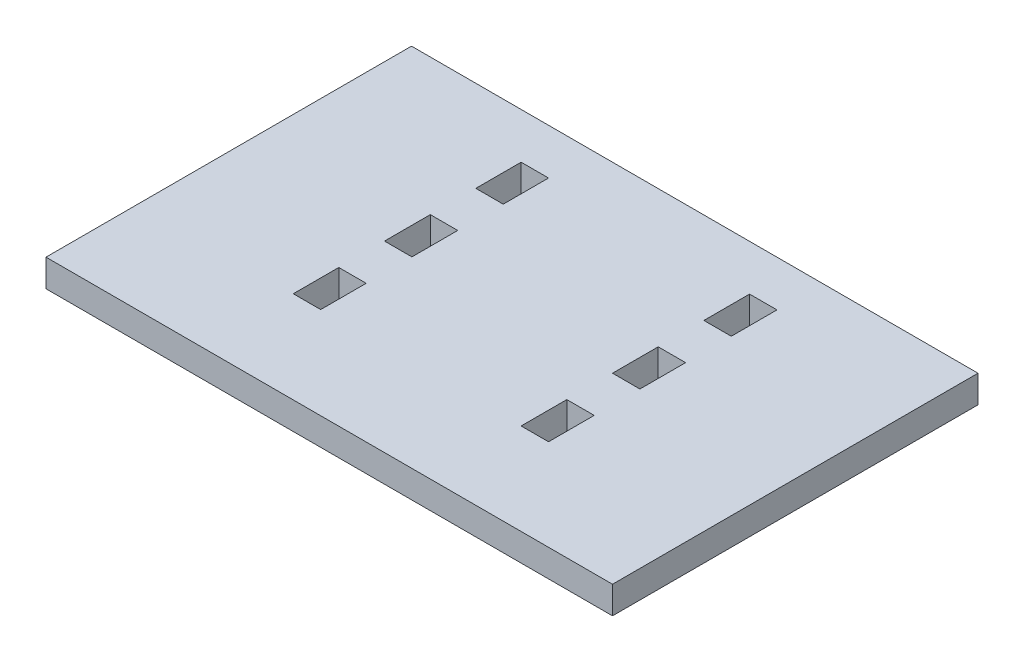
ISO-10303-21;
HEADER;
FILE_DESCRIPTION(('STEP AP214'),'2;1');
FILE_NAME('part.step','',(''),(''),'','','');
FILE_SCHEMA(('AUTOMOTIVE_DESIGN { 1 0 10303 214 1 1 1 1 }'));
ENDSEC;
DATA;
#1=APPLICATION_CONTEXT('core data for automotive mechanical design processes');
#2=APPLICATION_PROTOCOL_DEFINITION('international standard','automotive_design',2000,#1);
#3=PRODUCT_CONTEXT('',#1,'mechanical');
#4=PRODUCT('Part','Part','',(#3));
#5=PRODUCT_RELATED_PRODUCT_CATEGORY('part','',(#4));
#6=PRODUCT_DEFINITION_FORMATION('','',#4);
#7=PRODUCT_DEFINITION_CONTEXT('part definition',#1,'design');
#8=PRODUCT_DEFINITION('design','',#6,#7);
#9=PRODUCT_DEFINITION_SHAPE('','',#8);
#10=(LENGTH_UNIT() NAMED_UNIT(*) SI_UNIT(.MILLI.,.METRE.));
#11=(NAMED_UNIT(*) PLANE_ANGLE_UNIT() SI_UNIT($,.RADIAN.));
#12=(NAMED_UNIT(*) SI_UNIT($,.STERADIAN.) SOLID_ANGLE_UNIT());
#13=UNCERTAINTY_MEASURE_WITH_UNIT(LENGTH_MEASURE(1.E-05),#10,'distance_accuracy_value','');
#14=(GEOMETRIC_REPRESENTATION_CONTEXT(3) GLOBAL_UNCERTAINTY_ASSIGNED_CONTEXT((#13)) GLOBAL_UNIT_ASSIGNED_CONTEXT((#10,
#11,#12)) REPRESENTATION_CONTEXT('',''));
#15=CARTESIAN_POINT('',(0.,0.,0.));
#16=DIRECTION('',(0.,0.,1.));
#17=DIRECTION('',(1.,0.,0.));
#18=AXIS2_PLACEMENT_3D('',#15,#16,#17);
#19=CARTESIAN_POINT('',(0.,3.,0.));
#20=DIRECTION('',(0.,0.,-1.));
#21=DIRECTION('',(-1.,0.,0.));
#22=AXIS2_PLACEMENT_3D('',#19,#20,#21);
#23=PLANE('',#22);
#24=DIRECTION('',(1.,0.,0.));
#25=VECTOR('',#24,1.);
#26=CARTESIAN_POINT('',(0.,0.,0.));
#27=LINE('',#26,#25);
#28=CARTESIAN_POINT('',(-20.,0.,0.));
#29=VERTEX_POINT('',#28);
#30=CARTESIAN_POINT('',(42.,0.,0.));
#31=VERTEX_POINT('',#30);
#32=EDGE_CURVE('E314',#29,#31,#27,.T.);
#33=ORIENTED_EDGE('',*,*,#32,.T.);
#34=DIRECTION('',(0.,-1.,0.));
#35=VECTOR('',#34,1.);
#36=CARTESIAN_POINT('',(42.,3.,0.));
#37=LINE('',#36,#35);
#38=CARTESIAN_POINT('',(42.,3.,0.));
#39=VERTEX_POINT('',#38);
#40=EDGE_CURVE('E11',#39,#31,#37,.T.);
#41=ORIENTED_EDGE('',*,*,#40,.F.);
#42=DIRECTION('',(1.,0.,0.));
#43=VECTOR('',#42,1.);
#44=CARTESIAN_POINT('',(0.,3.,0.));
#45=LINE('',#44,#43);
#46=CARTESIAN_POINT('',(-20.,3.,0.));
#47=VERTEX_POINT('',#46);
#48=EDGE_CURVE('E243',#47,#39,#45,.T.);
#49=ORIENTED_EDGE('',*,*,#48,.F.);
#50=DIRECTION('',(0.,-1.,0.));
#51=VECTOR('',#50,1.);
#52=CARTESIAN_POINT('',(-20.,3.,0.));
#53=LINE('',#52,#51);
#54=EDGE_CURVE('E322',#47,#29,#53,.T.);
#55=ORIENTED_EDGE('',*,*,#54,.T.);
#56=EDGE_LOOP('',(#33,#41,#49,#55));
#57=FACE_BOUND('',#56,.T.);
#58=ADVANCED_FACE('F38',(#57),#23,.F.);
#59=CARTESIAN_POINT('',(42.,3.,0.));
#60=DIRECTION('',(1.,0.,0.));
#61=DIRECTION('',(0.,0.,-1.));
#62=AXIS2_PLACEMENT_3D('',#59,#60,#61);
#63=PLANE('',#62);
#64=DIRECTION('',(0.,0.,1.));
#65=VECTOR('',#64,1.);
#66=CARTESIAN_POINT('',(42.,0.,0.));
#67=LINE('',#66,#65);
#68=CARTESIAN_POINT('',(42.,0.,-40.));
#69=VERTEX_POINT('',#68);
#70=EDGE_CURVE('E234',#69,#31,#67,.T.);
#71=ORIENTED_EDGE('',*,*,#70,.F.);
#72=DIRECTION('',(0.,-1.,0.));
#73=VECTOR('',#72,1.);
#74=CARTESIAN_POINT('',(42.,3.,-40.));
#75=LINE('',#74,#73);
#76=CARTESIAN_POINT('',(42.,3.,-40.));
#77=VERTEX_POINT('',#76);
#78=EDGE_CURVE('E48',#77,#69,#75,.T.);
#79=ORIENTED_EDGE('',*,*,#78,.F.);
#80=DIRECTION('',(0.,0.,1.));
#81=VECTOR('',#80,1.);
#82=CARTESIAN_POINT('',(42.,3.,0.));
#83=LINE('',#82,#81);
#84=EDGE_CURVE('E232',#77,#39,#83,.T.);
#85=ORIENTED_EDGE('',*,*,#84,.T.);
#86=ORIENTED_EDGE('',*,*,#40,.T.);
#87=EDGE_LOOP('',(#71,#79,#85,#86));
#88=FACE_BOUND('',#87,.T.);
#89=ADVANCED_FACE('F231',(#88),#63,.T.);
#90=CARTESIAN_POINT('',(0.,3.,-40.));
#91=DIRECTION('',(0.,0.,-1.));
#92=DIRECTION('',(-1.,0.,0.));
#93=AXIS2_PLACEMENT_3D('',#90,#91,#92);
#94=PLANE('',#93);
#95=DIRECTION('',(1.,0.,0.));
#96=VECTOR('',#95,1.);
#97=CARTESIAN_POINT('',(0.,0.,-40.));
#98=LINE('',#97,#96);
#99=CARTESIAN_POINT('',(-20.,0.,-40.));
#100=VERTEX_POINT('',#99);
#101=EDGE_CURVE('E318',#100,#69,#98,.T.);
#102=ORIENTED_EDGE('',*,*,#101,.F.);
#103=DIRECTION('',(0.,-1.,0.));
#104=VECTOR('',#103,1.);
#105=CARTESIAN_POINT('',(-20.,3.,-40.));
#106=LINE('',#105,#104);
#107=CARTESIAN_POINT('',(-20.,3.,-40.));
#108=VERTEX_POINT('',#107);
#109=EDGE_CURVE('E144',#108,#100,#106,.T.);
#110=ORIENTED_EDGE('',*,*,#109,.F.);
#111=DIRECTION('',(1.,0.,0.));
#112=VECTOR('',#111,1.);
#113=CARTESIAN_POINT('',(0.,3.,-40.));
#114=LINE('',#113,#112);
#115=EDGE_CURVE('E241',#108,#77,#114,.T.);
#116=ORIENTED_EDGE('',*,*,#115,.T.);
#117=ORIENTED_EDGE('',*,*,#78,.T.);
#118=EDGE_LOOP('',(#102,#110,#116,#117));
#119=FACE_BOUND('',#118,.T.);
#120=ADVANCED_FACE('F246',(#119),#94,.T.);
#121=CARTESIAN_POINT('',(0.,3.,0.));
#122=DIRECTION('',(-1.,0.,0.));
#123=DIRECTION('',(0.,0.,1.));
#124=AXIS2_PLACEMENT_3D('',#121,#122,#123);
#125=PLANE('',#124);
#126=DIRECTION('',(0.,0.,-1.));
#127=VECTOR('',#126,1.);
#128=CARTESIAN_POINT('',(0.,0.,0.));
#129=LINE('',#128,#127);
#130=CARTESIAN_POINT('',(0.,0.,-30.0396951821505));
#131=VERTEX_POINT('',#130);
#132=CARTESIAN_POINT('',(0.,0.,-35.));
#133=VERTEX_POINT('',#132);
#134=EDGE_CURVE('E286',#131,#133,#129,.T.);
#135=ORIENTED_EDGE('',*,*,#134,.F.);
#136=DIRECTION('',(0.,-1.,0.));
#137=VECTOR('',#136,1.);
#138=CARTESIAN_POINT('',(0.,3.,-30.0396951821505));
#139=LINE('',#138,#137);
#140=CARTESIAN_POINT('',(0.,3.,-30.0396951821505));
#141=VERTEX_POINT('',#140);
#142=EDGE_CURVE('E324',#141,#131,#139,.T.);
#143=ORIENTED_EDGE('',*,*,#142,.F.);
#144=DIRECTION('',(0.,0.,-1.));
#145=VECTOR('',#144,1.);
#146=CARTESIAN_POINT('',(0.,3.,0.));
#147=LINE('',#146,#145);
#148=CARTESIAN_POINT('',(0.,3.,-35.));
#149=VERTEX_POINT('',#148);
#150=EDGE_CURVE('E423',#141,#149,#147,.T.);
#151=ORIENTED_EDGE('',*,*,#150,.T.);
#152=DIRECTION('',(0.,-1.,0.));
#153=VECTOR('',#152,1.);
#154=CARTESIAN_POINT('',(0.,3.,-35.));
#155=LINE('',#154,#153);
#156=EDGE_CURVE('E326',#149,#133,#155,.T.);
#157=ORIENTED_EDGE('',*,*,#156,.T.);
#158=EDGE_LOOP('',(#135,#143,#151,#157));
#159=FACE_BOUND('',#158,.T.);
#160=ADVANCED_FACE('F513',(#159),#125,.T.);
#161=CARTESIAN_POINT('',(0.,3.,-30.0396951821505));
#162=DIRECTION('',(0.,0.,1.));
#163=DIRECTION('',(1.,0.,0.));
#164=AXIS2_PLACEMENT_3D('',#161,#162,#163);
#165=PLANE('',#164);
#166=DIRECTION('',(-1.,0.,0.));
#167=VECTOR('',#166,1.);
#168=CARTESIAN_POINT('',(0.,0.,-30.0396951821505));
#169=LINE('',#168,#167);
#170=CARTESIAN_POINT('',(-3.,0.,-30.0396951821505));
#171=VERTEX_POINT('',#170);
#172=EDGE_CURVE('E305',#131,#171,#169,.T.);
#173=ORIENTED_EDGE('',*,*,#172,.T.);
#174=DIRECTION('',(0.,-1.,0.));
#175=VECTOR('',#174,1.);
#176=CARTESIAN_POINT('',(-3.,3.,-30.0396951821505));
#177=LINE('',#176,#175);
#178=CARTESIAN_POINT('',(-3.,3.,-30.0396951821505));
#179=VERTEX_POINT('',#178);
#180=EDGE_CURVE('E331',#179,#171,#177,.T.);
#181=ORIENTED_EDGE('',*,*,#180,.F.);
#182=DIRECTION('',(-1.,0.,0.));
#183=VECTOR('',#182,1.);
#184=CARTESIAN_POINT('',(0.,3.,-30.0396951821505));
#185=LINE('',#184,#183);
#186=EDGE_CURVE('E440',#141,#179,#185,.T.);
#187=ORIENTED_EDGE('',*,*,#186,.F.);
#188=ORIENTED_EDGE('',*,*,#142,.T.);
#189=EDGE_LOOP('',(#173,#181,#187,#188));
#190=FACE_BOUND('',#189,.T.);
#191=ADVANCED_FACE('F510',(#190),#165,.F.);
#192=CARTESIAN_POINT('',(-3.,3.,0.));
#193=DIRECTION('',(1.,0.,0.));
#194=DIRECTION('',(0.,0.,-1.));
#195=AXIS2_PLACEMENT_3D('',#192,#193,#194);
#196=PLANE('',#195);
#197=DIRECTION('',(0.,0.,1.));
#198=VECTOR('',#197,1.);
#199=CARTESIAN_POINT('',(-3.,0.,0.));
#200=LINE('',#199,#198);
#201=CARTESIAN_POINT('',(-3.,0.,-35.));
#202=VERTEX_POINT('',#201);
#203=EDGE_CURVE('E308',#202,#171,#200,.T.);
#204=ORIENTED_EDGE('',*,*,#203,.F.);
#205=DIRECTION('',(0.,-1.,0.));
#206=VECTOR('',#205,1.);
#207=CARTESIAN_POINT('',(-3.,3.,-35.));
#208=LINE('',#207,#206);
#209=CARTESIAN_POINT('',(-3.,3.,-35.));
#210=VERTEX_POINT('',#209);
#211=EDGE_CURVE('E328',#210,#202,#208,.T.);
#212=ORIENTED_EDGE('',*,*,#211,.F.);
#213=DIRECTION('',(0.,0.,1.));
#214=VECTOR('',#213,1.);
#215=CARTESIAN_POINT('',(-3.,3.,0.));
#216=LINE('',#215,#214);
#217=EDGE_CURVE('E442',#210,#179,#216,.T.);
#218=ORIENTED_EDGE('',*,*,#217,.T.);
#219=ORIENTED_EDGE('',*,*,#180,.T.);
#220=EDGE_LOOP('',(#204,#212,#218,#219));
#221=FACE_BOUND('',#220,.T.);
#222=ADVANCED_FACE('F459',(#221),#196,.T.);
#223=CARTESIAN_POINT('',(0.,0.,-20.0456534086488));
#224=VERTEX_POINT('',#223);
#225=CARTESIAN_POINT('',(0.,0.,-25.0601748364164));
#226=VERTEX_POINT('',#225);
#227=EDGE_CURVE('E287',#224,#226,#129,.T.);
#228=ORIENTED_EDGE('',*,*,#227,.F.);
#229=DIRECTION('',(0.,-1.,0.));
#230=VECTOR('',#229,1.);
#231=CARTESIAN_POINT('',(0.,3.,-20.0456534086488));
#232=LINE('',#231,#230);
#233=CARTESIAN_POINT('',(0.,3.,-20.0456534086488));
#234=VERTEX_POINT('',#233);
#235=EDGE_CURVE('E329',#234,#224,#232,.T.);
#236=ORIENTED_EDGE('',*,*,#235,.F.);
#237=CARTESIAN_POINT('',(0.,3.,-25.0601748364164));
#238=VERTEX_POINT('',#237);
#239=EDGE_CURVE('E424',#234,#238,#147,.T.);
#240=ORIENTED_EDGE('',*,*,#239,.T.);
#241=DIRECTION('',(0.,-1.,0.));
#242=VECTOR('',#241,1.);
#243=CARTESIAN_POINT('',(0.,3.,-25.0601748364164));
#244=LINE('',#243,#242);
#245=EDGE_CURVE('E334',#238,#226,#244,.T.);
#246=ORIENTED_EDGE('',*,*,#245,.T.);
#247=EDGE_LOOP('',(#228,#236,#240,#246));
#248=FACE_BOUND('',#247,.T.);
#249=ADVANCED_FACE('F485',(#248),#125,.T.);
#250=CARTESIAN_POINT('',(0.,3.,-20.0456534086488));
#251=DIRECTION('',(0.,0.,1.));
#252=DIRECTION('',(1.,0.,0.));
#253=AXIS2_PLACEMENT_3D('',#250,#251,#252);
#254=PLANE('',#253);
#255=DIRECTION('',(-1.,0.,0.));
#256=VECTOR('',#255,1.);
#257=CARTESIAN_POINT('',(0.,0.,-20.0456534086488));
#258=LINE('',#257,#256);
#259=CARTESIAN_POINT('',(-3.,0.,-20.0456534086488));
#260=VERTEX_POINT('',#259);
#261=EDGE_CURVE('E296',#224,#260,#258,.T.);
#262=ORIENTED_EDGE('',*,*,#261,.T.);
#263=DIRECTION('',(0.,-1.,0.));
#264=VECTOR('',#263,1.);
#265=CARTESIAN_POINT('',(-3.,3.,-20.0456534086488));
#266=LINE('',#265,#264);
#267=CARTESIAN_POINT('',(-3.,3.,-20.0456534086488));
#268=VERTEX_POINT('',#267);
#269=EDGE_CURVE('E339',#268,#260,#266,.T.);
#270=ORIENTED_EDGE('',*,*,#269,.F.);
#271=DIRECTION('',(-1.,0.,0.));
#272=VECTOR('',#271,1.);
#273=CARTESIAN_POINT('',(0.,3.,-20.0456534086488));
#274=LINE('',#273,#272);
#275=EDGE_CURVE('E432',#234,#268,#274,.T.);
#276=ORIENTED_EDGE('',*,*,#275,.F.);
#277=ORIENTED_EDGE('',*,*,#235,.T.);
#278=EDGE_LOOP('',(#262,#270,#276,#277));
#279=FACE_BOUND('',#278,.T.);
#280=ADVANCED_FACE('F483',(#279),#254,.F.);
#281=CARTESIAN_POINT('',(-3.,3.,0.));
#282=DIRECTION('',(1.,0.,0.));
#283=DIRECTION('',(0.,0.,-1.));
#284=AXIS2_PLACEMENT_3D('',#281,#282,#283);
#285=PLANE('',#284);
#286=DIRECTION('',(0.,0.,1.));
#287=VECTOR('',#286,1.);
#288=CARTESIAN_POINT('',(-3.,0.,0.));
#289=LINE('',#288,#287);
#290=CARTESIAN_POINT('',(-3.,0.,-25.0601748364164));
#291=VERTEX_POINT('',#290);
#292=EDGE_CURVE('E299',#291,#260,#289,.T.);
#293=ORIENTED_EDGE('',*,*,#292,.F.);
#294=DIRECTION('',(0.,-1.,0.));
#295=VECTOR('',#294,1.);
#296=CARTESIAN_POINT('',(-3.,3.,-25.0601748364164));
#297=LINE('',#296,#295);
#298=CARTESIAN_POINT('',(-3.,3.,-25.0601748364164));
#299=VERTEX_POINT('',#298);
#300=EDGE_CURVE('E336',#299,#291,#297,.T.);
#301=ORIENTED_EDGE('',*,*,#300,.F.);
#302=DIRECTION('',(0.,0.,1.));
#303=VECTOR('',#302,1.);
#304=CARTESIAN_POINT('',(-3.,3.,0.));
#305=LINE('',#304,#303);
#306=EDGE_CURVE('E434',#299,#268,#305,.T.);
#307=ORIENTED_EDGE('',*,*,#306,.T.);
#308=ORIENTED_EDGE('',*,*,#269,.T.);
#309=EDGE_LOOP('',(#293,#301,#307,#308));
#310=FACE_BOUND('',#309,.T.);
#311=ADVANCED_FACE('F479',(#310),#285,.T.);
#312=CARTESIAN_POINT('',(0.,0.,-10.0627705245664));
#313=VERTEX_POINT('',#312);
#314=CARTESIAN_POINT('',(0.,0.,-15.0419221686592));
#315=VERTEX_POINT('',#314);
#316=EDGE_CURVE('E282',#313,#315,#129,.T.);
#317=ORIENTED_EDGE('',*,*,#316,.F.);
#318=DIRECTION('',(0.,-1.,0.));
#319=VECTOR('',#318,1.);
#320=CARTESIAN_POINT('',(0.,3.,-10.0627705245664));
#321=LINE('',#320,#319);
#322=CARTESIAN_POINT('',(0.,3.,-10.0627705245664));
#323=VERTEX_POINT('',#322);
#324=EDGE_CURVE('E337',#323,#313,#321,.T.);
#325=ORIENTED_EDGE('',*,*,#324,.F.);
#326=CARTESIAN_POINT('',(0.,3.,-15.0419221686592));
#327=VERTEX_POINT('',#326);
#328=EDGE_CURVE('E419',#323,#327,#147,.T.);
#329=ORIENTED_EDGE('',*,*,#328,.T.);
#330=DIRECTION('',(0.,-1.,0.));
#331=VECTOR('',#330,1.);
#332=CARTESIAN_POINT('',(0.,3.,-15.0419221686592));
#333=LINE('',#332,#331);
#334=EDGE_CURVE('E342',#327,#315,#333,.T.);
#335=ORIENTED_EDGE('',*,*,#334,.T.);
#336=EDGE_LOOP('',(#317,#325,#329,#335));
#337=FACE_BOUND('',#336,.T.);
#338=ADVANCED_FACE('F517',(#337),#125,.T.);
#339=CARTESIAN_POINT('',(0.,3.,-10.0627705245664));
#340=DIRECTION('',(0.,0.,1.));
#341=DIRECTION('',(1.,0.,0.));
#342=AXIS2_PLACEMENT_3D('',#339,#340,#341);
#343=PLANE('',#342);
#344=DIRECTION('',(-1.,0.,0.));
#345=VECTOR('',#344,1.);
#346=CARTESIAN_POINT('',(0.,0.,-10.0627705245664));
#347=LINE('',#346,#345);
#348=CARTESIAN_POINT('',(-3.,0.,-10.0627705245664));
#349=VERTEX_POINT('',#348);
#350=EDGE_CURVE('E285',#313,#349,#347,.T.);
#351=ORIENTED_EDGE('',*,*,#350,.T.);
#352=DIRECTION('',(0.,-1.,0.));
#353=VECTOR('',#352,1.);
#354=CARTESIAN_POINT('',(-3.,3.,-10.0627705245664));
#355=LINE('',#354,#353);
#356=CARTESIAN_POINT('',(-3.,3.,-10.0627705245664));
#357=VERTEX_POINT('',#356);
#358=EDGE_CURVE('E347',#357,#349,#355,.T.);
#359=ORIENTED_EDGE('',*,*,#358,.F.);
#360=DIRECTION('',(-1.,0.,0.));
#361=VECTOR('',#360,1.);
#362=CARTESIAN_POINT('',(0.,3.,-10.0627705245664));
#363=LINE('',#362,#361);
#364=EDGE_CURVE('E422',#323,#357,#363,.T.);
#365=ORIENTED_EDGE('',*,*,#364,.F.);
#366=ORIENTED_EDGE('',*,*,#324,.T.);
#367=EDGE_LOOP('',(#351,#359,#365,#366));
#368=FACE_BOUND('',#367,.T.);
#369=ADVANCED_FACE('F533',(#368),#343,.F.);
#370=CARTESIAN_POINT('',(-3.,3.,0.));
#371=DIRECTION('',(1.,0.,0.));
#372=DIRECTION('',(0.,0.,-1.));
#373=AXIS2_PLACEMENT_3D('',#370,#371,#372);
#374=PLANE('',#373);
#375=DIRECTION('',(0.,0.,1.));
#376=VECTOR('',#375,1.);
#377=CARTESIAN_POINT('',(-3.,0.,0.));
#378=LINE('',#377,#376);
#379=CARTESIAN_POINT('',(-3.,0.,-15.0419221686592));
#380=VERTEX_POINT('',#379);
#381=EDGE_CURVE('E290',#380,#349,#378,.T.);
#382=ORIENTED_EDGE('',*,*,#381,.F.);
#383=DIRECTION('',(0.,-1.,0.));
#384=VECTOR('',#383,1.);
#385=CARTESIAN_POINT('',(-3.,3.,-15.0419221686592));
#386=LINE('',#385,#384);
#387=CARTESIAN_POINT('',(-3.,3.,-15.0419221686592));
#388=VERTEX_POINT('',#387);
#389=EDGE_CURVE('E344',#388,#380,#386,.T.);
#390=ORIENTED_EDGE('',*,*,#389,.F.);
#391=DIRECTION('',(0.,0.,1.));
#392=VECTOR('',#391,1.);
#393=CARTESIAN_POINT('',(-3.,3.,0.));
#394=LINE('',#393,#392);
#395=EDGE_CURVE('E426',#388,#357,#394,.T.);
#396=ORIENTED_EDGE('',*,*,#395,.T.);
#397=ORIENTED_EDGE('',*,*,#358,.T.);
#398=EDGE_LOOP('',(#382,#390,#396,#397));
#399=FACE_BOUND('',#398,.T.);
#400=ADVANCED_FACE('F529',(#399),#374,.T.);
#401=CARTESIAN_POINT('',(0.,3.,-30.));
#402=DIRECTION('',(0.,0.,-1.));
#403=DIRECTION('',(-1.,0.,0.));
#404=AXIS2_PLACEMENT_3D('',#401,#402,#403);
#405=PLANE('',#404);
#406=DIRECTION('',(1.,0.,0.));
#407=VECTOR('',#406,1.);
#408=CARTESIAN_POINT('',(0.,0.,-30.));
#409=LINE('',#408,#407);
#410=CARTESIAN_POINT('',(22.,0.,-30.));
#411=VERTEX_POINT('',#410);
#412=CARTESIAN_POINT('',(24.9981122641106,0.,-30.));
#413=VERTEX_POINT('',#412);
#414=EDGE_CURVE('E273',#411,#413,#409,.T.);
#415=ORIENTED_EDGE('',*,*,#414,.F.);
#416=DIRECTION('',(0.,-1.,0.));
#417=VECTOR('',#416,1.);
#418=CARTESIAN_POINT('',(22.,3.,-30.));
#419=LINE('',#418,#417);
#420=CARTESIAN_POINT('',(22.,3.,-30.));
#421=VERTEX_POINT('',#420);
#422=EDGE_CURVE('E345',#421,#411,#419,.T.);
#423=ORIENTED_EDGE('',*,*,#422,.F.);
#424=DIRECTION('',(1.,0.,0.));
#425=VECTOR('',#424,1.);
#426=CARTESIAN_POINT('',(0.,3.,-30.));
#427=LINE('',#426,#425);
#428=CARTESIAN_POINT('',(24.9981122641106,3.,-30.));
#429=VERTEX_POINT('',#428);
#430=EDGE_CURVE('E411',#421,#429,#427,.T.);
#431=ORIENTED_EDGE('',*,*,#430,.T.);
#432=DIRECTION('',(0.,-1.,0.));
#433=VECTOR('',#432,1.);
#434=CARTESIAN_POINT('',(24.9981122641106,3.,-30.));
#435=LINE('',#434,#433);
#436=EDGE_CURVE('E350',#429,#413,#435,.T.);
#437=ORIENTED_EDGE('',*,*,#436,.T.);
#438=EDGE_LOOP('',(#415,#423,#431,#437));
#439=FACE_BOUND('',#438,.T.);
#440=ADVANCED_FACE('F532',(#439),#405,.T.);
#441=CARTESIAN_POINT('',(22.,3.,0.));
#442=DIRECTION('',(-1.,0.,0.));
#443=DIRECTION('',(0.,0.,1.));
#444=AXIS2_PLACEMENT_3D('',#441,#442,#443);
#445=PLANE('',#444);
#446=DIRECTION('',(0.,0.,-1.));
#447=VECTOR('',#446,1.);
#448=CARTESIAN_POINT('',(22.,0.,0.));
#449=LINE('',#448,#447);
#450=CARTESIAN_POINT('',(22.,0.,-35.));
#451=VERTEX_POINT('',#450);
#452=EDGE_CURVE('E258',#411,#451,#449,.T.);
#453=ORIENTED_EDGE('',*,*,#452,.T.);
#454=DIRECTION('',(0.,-1.,0.));
#455=VECTOR('',#454,1.);
#456=CARTESIAN_POINT('',(22.,3.,-35.));
#457=LINE('',#456,#455);
#458=CARTESIAN_POINT('',(22.,3.,-35.));
#459=VERTEX_POINT('',#458);
#460=EDGE_CURVE('E356',#459,#451,#457,.T.);
#461=ORIENTED_EDGE('',*,*,#460,.F.);
#462=DIRECTION('',(0.,0.,-1.));
#463=VECTOR('',#462,1.);
#464=CARTESIAN_POINT('',(22.,3.,0.));
#465=LINE('',#464,#463);
#466=EDGE_CURVE('E400',#421,#459,#465,.T.);
#467=ORIENTED_EDGE('',*,*,#466,.F.);
#468=ORIENTED_EDGE('',*,*,#422,.T.);
#469=EDGE_LOOP('',(#453,#461,#467,#468));
#470=FACE_BOUND('',#469,.T.);
#471=ADVANCED_FACE('F546',(#470),#445,.F.);
#472=CARTESIAN_POINT('',(0.,3.,-35.));
#473=DIRECTION('',(0.,0.,-1.));
#474=DIRECTION('',(-1.,0.,0.));
#475=AXIS2_PLACEMENT_3D('',#472,#473,#474);
#476=PLANE('',#475);
#477=DIRECTION('',(1.,0.,0.));
#478=VECTOR('',#477,1.);
#479=CARTESIAN_POINT('',(0.,0.,-35.));
#480=LINE('',#479,#478);
#481=CARTESIAN_POINT('',(24.9981122641106,0.,-35.));
#482=VERTEX_POINT('',#481);
#483=EDGE_CURVE('E276',#451,#482,#480,.T.);
#484=ORIENTED_EDGE('',*,*,#483,.T.);
#485=DIRECTION('',(0.,-1.,0.));
#486=VECTOR('',#485,1.);
#487=CARTESIAN_POINT('',(24.9981122641106,3.,-35.));
#488=LINE('',#487,#486);
#489=CARTESIAN_POINT('',(24.9981122641106,3.,-35.));
#490=VERTEX_POINT('',#489);
#491=EDGE_CURVE('E352',#490,#482,#488,.T.);
#492=ORIENTED_EDGE('',*,*,#491,.F.);
#493=DIRECTION('',(1.,0.,0.));
#494=VECTOR('',#493,1.);
#495=CARTESIAN_POINT('',(0.,3.,-35.));
#496=LINE('',#495,#494);
#497=EDGE_CURVE('E414',#459,#490,#496,.T.);
#498=ORIENTED_EDGE('',*,*,#497,.F.);
#499=ORIENTED_EDGE('',*,*,#460,.T.);
#500=EDGE_LOOP('',(#484,#492,#498,#499));
#501=FACE_BOUND('',#500,.T.);
#502=ADVANCED_FACE('F542',(#501),#476,.F.);
#503=CARTESIAN_POINT('',(0.,3.,-20.));
#504=DIRECTION('',(0.,0.,-1.));
#505=DIRECTION('',(-1.,0.,0.));
#506=AXIS2_PLACEMENT_3D('',#503,#504,#505);
#507=PLANE('',#506);
#508=DIRECTION('',(1.,0.,0.));
#509=VECTOR('',#508,1.);
#510=CARTESIAN_POINT('',(0.,0.,-20.));
#511=LINE('',#510,#509);
#512=CARTESIAN_POINT('',(22.,0.,-20.));
#513=VERTEX_POINT('',#512);
#514=CARTESIAN_POINT('',(24.9981122641106,0.,-20.));
#515=VERTEX_POINT('',#514);
#516=EDGE_CURVE('E264',#513,#515,#511,.T.);
#517=ORIENTED_EDGE('',*,*,#516,.F.);
#518=DIRECTION('',(0.,-1.,0.));
#519=VECTOR('',#518,1.);
#520=CARTESIAN_POINT('',(22.,3.,-20.));
#521=LINE('',#520,#519);
#522=CARTESIAN_POINT('',(22.,3.,-20.));
#523=VERTEX_POINT('',#522);
#524=EDGE_CURVE('E353',#523,#513,#521,.T.);
#525=ORIENTED_EDGE('',*,*,#524,.F.);
#526=DIRECTION('',(1.,0.,0.));
#527=VECTOR('',#526,1.);
#528=CARTESIAN_POINT('',(0.,3.,-20.));
#529=LINE('',#528,#527);
#530=CARTESIAN_POINT('',(24.9981122641106,3.,-20.));
#531=VERTEX_POINT('',#530);
#532=EDGE_CURVE('E397',#523,#531,#529,.T.);
#533=ORIENTED_EDGE('',*,*,#532,.T.);
#534=DIRECTION('',(0.,-1.,0.));
#535=VECTOR('',#534,1.);
#536=CARTESIAN_POINT('',(24.9981122641106,3.,-20.));
#537=LINE('',#536,#535);
#538=EDGE_CURVE('E360',#531,#515,#537,.T.);
#539=ORIENTED_EDGE('',*,*,#538,.T.);
#540=EDGE_LOOP('',(#517,#525,#533,#539));
#541=FACE_BOUND('',#540,.T.);
#542=ADVANCED_FACE('F545',(#541),#507,.T.);
#543=CARTESIAN_POINT('',(22.,0.,-25.));
#544=VERTEX_POINT('',#543);
#545=EDGE_CURVE('E259',#513,#544,#449,.T.);
#546=ORIENTED_EDGE('',*,*,#545,.T.);
#547=DIRECTION('',(0.,-1.,0.));
#548=VECTOR('',#547,1.);
#549=CARTESIAN_POINT('',(22.,3.,-25.));
#550=LINE('',#549,#548);
#551=CARTESIAN_POINT('',(22.,3.,-25.));
#552=VERTEX_POINT('',#551);
#553=EDGE_CURVE('E365',#552,#544,#550,.T.);
#554=ORIENTED_EDGE('',*,*,#553,.F.);
#555=EDGE_CURVE('E401',#523,#552,#465,.T.);
#556=ORIENTED_EDGE('',*,*,#555,.F.);
#557=ORIENTED_EDGE('',*,*,#524,.T.);
#558=EDGE_LOOP('',(#546,#554,#556,#557));
#559=FACE_BOUND('',#558,.T.);
#560=ADVANCED_FACE('F551',(#559),#445,.F.);
#561=CARTESIAN_POINT('',(0.,3.,-25.));
#562=DIRECTION('',(0.,0.,-1.));
#563=DIRECTION('',(-1.,0.,0.));
#564=AXIS2_PLACEMENT_3D('',#561,#562,#563);
#565=PLANE('',#564);
#566=DIRECTION('',(1.,0.,0.));
#567=VECTOR('',#566,1.);
#568=CARTESIAN_POINT('',(0.,0.,-25.));
#569=LINE('',#568,#567);
#570=CARTESIAN_POINT('',(24.9981122641106,0.,-25.));
#571=VERTEX_POINT('',#570);
#572=EDGE_CURVE('E267',#544,#571,#569,.T.);
#573=ORIENTED_EDGE('',*,*,#572,.T.);
#574=DIRECTION('',(0.,-1.,0.));
#575=VECTOR('',#574,1.);
#576=CARTESIAN_POINT('',(24.9981122641106,3.,-25.));
#577=LINE('',#576,#575);
#578=CARTESIAN_POINT('',(24.9981122641106,3.,-25.));
#579=VERTEX_POINT('',#578);
#580=EDGE_CURVE('E362',#579,#571,#577,.T.);
#581=ORIENTED_EDGE('',*,*,#580,.F.);
#582=DIRECTION('',(1.,0.,0.));
#583=VECTOR('',#582,1.);
#584=CARTESIAN_POINT('',(0.,3.,-25.));
#585=LINE('',#584,#583);
#586=EDGE_CURVE('E406',#552,#579,#585,.T.);
#587=ORIENTED_EDGE('',*,*,#586,.F.);
#588=ORIENTED_EDGE('',*,*,#553,.T.);
#589=EDGE_LOOP('',(#573,#581,#587,#588));
#590=FACE_BOUND('',#589,.T.);
#591=ADVANCED_FACE('F558',(#590),#565,.F.);
#592=CARTESIAN_POINT('',(0.,3.,-10.));
#593=DIRECTION('',(0.,0.,-1.));
#594=DIRECTION('',(-1.,0.,0.));
#595=AXIS2_PLACEMENT_3D('',#592,#593,#594);
#596=PLANE('',#595);
#597=DIRECTION('',(1.,0.,0.));
#598=VECTOR('',#597,1.);
#599=CARTESIAN_POINT('',(0.,0.,-10.));
#600=LINE('',#599,#598);
#601=CARTESIAN_POINT('',(22.,0.,-10.));
#602=VERTEX_POINT('',#601);
#603=CARTESIAN_POINT('',(24.9981122641106,0.,-10.));
#604=VERTEX_POINT('',#603);
#605=EDGE_CURVE('E252',#602,#604,#600,.T.);
#606=ORIENTED_EDGE('',*,*,#605,.F.);
#607=DIRECTION('',(0.,-1.,0.));
#608=VECTOR('',#607,1.);
#609=CARTESIAN_POINT('',(22.,3.,-10.));
#610=LINE('',#609,#608);
#611=CARTESIAN_POINT('',(22.,3.,-10.));
#612=VERTEX_POINT('',#611);
#613=EDGE_CURVE('E42',#612,#602,#610,.T.);
#614=ORIENTED_EDGE('',*,*,#613,.F.);
#615=DIRECTION('',(1.,0.,0.));
#616=VECTOR('',#615,1.);
#617=CARTESIAN_POINT('',(0.,3.,-10.));
#618=LINE('',#617,#616);
#619=CARTESIAN_POINT('',(24.9981122641106,3.,-10.));
#620=VERTEX_POINT('',#619);
#621=EDGE_CURVE('E321',#612,#620,#618,.T.);
#622=ORIENTED_EDGE('',*,*,#621,.T.);
#623=DIRECTION('',(0.,-1.,0.));
#624=VECTOR('',#623,1.);
#625=CARTESIAN_POINT('',(24.9981122641106,3.,-10.));
#626=LINE('',#625,#624);
#627=EDGE_CURVE('E248',#620,#604,#626,.T.);
#628=ORIENTED_EDGE('',*,*,#627,.T.);
#629=EDGE_LOOP('',(#606,#614,#622,#628));
#630=FACE_BOUND('',#629,.T.);
#631=ADVANCED_FACE('F40',(#630),#596,.T.);
#632=CARTESIAN_POINT('',(22.,0.,-15.));
#633=VERTEX_POINT('',#632);
#634=EDGE_CURVE('E255',#602,#633,#449,.T.);
#635=ORIENTED_EDGE('',*,*,#634,.T.);
#636=DIRECTION('',(0.,-1.,0.));
#637=VECTOR('',#636,1.);
#638=CARTESIAN_POINT('',(22.,3.,-15.));
#639=LINE('',#638,#637);
#640=CARTESIAN_POINT('',(22.,3.,-15.));
#641=VERTEX_POINT('',#640);
#642=EDGE_CURVE('E372',#641,#633,#639,.T.);
#643=ORIENTED_EDGE('',*,*,#642,.F.);
#644=EDGE_CURVE('E381',#612,#641,#465,.T.);
#645=ORIENTED_EDGE('',*,*,#644,.F.);
#646=ORIENTED_EDGE('',*,*,#613,.T.);
#647=EDGE_LOOP('',(#635,#643,#645,#646));
#648=FACE_BOUND('',#647,.T.);
#649=ADVANCED_FACE('F380',(#648),#445,.F.);
#650=CARTESIAN_POINT('',(0.,3.,-15.));
#651=DIRECTION('',(0.,0.,-1.));
#652=DIRECTION('',(-1.,0.,0.));
#653=AXIS2_PLACEMENT_3D('',#650,#651,#652);
#654=PLANE('',#653);
#655=DIRECTION('',(1.,0.,0.));
#656=VECTOR('',#655,1.);
#657=CARTESIAN_POINT('',(0.,0.,-15.));
#658=LINE('',#657,#656);
#659=CARTESIAN_POINT('',(24.9981122641106,0.,-15.));
#660=VERTEX_POINT('',#659);
#661=EDGE_CURVE('E257',#633,#660,#658,.T.);
#662=ORIENTED_EDGE('',*,*,#661,.T.);
#663=DIRECTION('',(0.,-1.,0.));
#664=VECTOR('',#663,1.);
#665=CARTESIAN_POINT('',(24.9981122641106,3.,-15.));
#666=LINE('',#665,#664);
#667=CARTESIAN_POINT('',(24.9981122641106,3.,-15.));
#668=VERTEX_POINT('',#667);
#669=EDGE_CURVE('E370',#668,#660,#666,.T.);
#670=ORIENTED_EDGE('',*,*,#669,.F.);
#671=DIRECTION('',(1.,0.,0.));
#672=VECTOR('',#671,1.);
#673=CARTESIAN_POINT('',(0.,3.,-15.));
#674=LINE('',#673,#672);
#675=EDGE_CURVE('E394',#641,#668,#674,.T.);
#676=ORIENTED_EDGE('',*,*,#675,.F.);
#677=ORIENTED_EDGE('',*,*,#642,.T.);
#678=EDGE_LOOP('',(#662,#670,#676,#677));
#679=FACE_BOUND('',#678,.T.);
#680=ADVANCED_FACE('F393',(#679),#654,.F.);
#681=CARTESIAN_POINT('',(0.,3.,-35.));
#682=DIRECTION('',(0.,0.,1.));
#683=DIRECTION('',(1.,0.,0.));
#684=AXIS2_PLACEMENT_3D('',#681,#682,#683);
#685=PLANE('',#684);
#686=DIRECTION('',(-1.,0.,0.));
#687=VECTOR('',#686,1.);
#688=CARTESIAN_POINT('',(0.,0.,-35.));
#689=LINE('',#688,#687);
#690=EDGE_CURVE('E311',#133,#202,#689,.T.);
#691=ORIENTED_EDGE('',*,*,#690,.F.);
#692=ORIENTED_EDGE('',*,*,#156,.F.);
#693=DIRECTION('',(-1.,0.,0.));
#694=VECTOR('',#693,1.);
#695=CARTESIAN_POINT('',(0.,3.,-35.));
#696=LINE('',#695,#694);
#697=EDGE_CURVE('E445',#149,#210,#696,.T.);
#698=ORIENTED_EDGE('',*,*,#697,.T.);
#699=ORIENTED_EDGE('',*,*,#211,.T.);
#700=EDGE_LOOP('',(#691,#692,#698,#699));
#701=FACE_BOUND('',#700,.T.);
#702=ADVANCED_FACE('F450',(#701),#685,.T.);
#703=CARTESIAN_POINT('',(0.,3.,-25.0601748364164));
#704=DIRECTION('',(0.,0.,1.));
#705=DIRECTION('',(1.,0.,0.));
#706=AXIS2_PLACEMENT_3D('',#703,#704,#705);
#707=PLANE('',#706);
#708=DIRECTION('',(-1.,0.,0.));
#709=VECTOR('',#708,1.);
#710=CARTESIAN_POINT('',(0.,0.,-25.0601748364164));
#711=LINE('',#710,#709);
#712=EDGE_CURVE('E302',#226,#291,#711,.T.);
#713=ORIENTED_EDGE('',*,*,#712,.F.);
#714=ORIENTED_EDGE('',*,*,#245,.F.);
#715=DIRECTION('',(-1.,0.,0.));
#716=VECTOR('',#715,1.);
#717=CARTESIAN_POINT('',(0.,3.,-25.0601748364164));
#718=LINE('',#717,#716);
#719=EDGE_CURVE('E437',#238,#299,#718,.T.);
#720=ORIENTED_EDGE('',*,*,#719,.T.);
#721=ORIENTED_EDGE('',*,*,#300,.T.);
#722=EDGE_LOOP('',(#713,#714,#720,#721));
#723=FACE_BOUND('',#722,.T.);
#724=ADVANCED_FACE('F473',(#723),#707,.T.);
#725=CARTESIAN_POINT('',(0.,3.,-15.0419221686592));
#726=DIRECTION('',(0.,0.,1.));
#727=DIRECTION('',(1.,0.,0.));
#728=AXIS2_PLACEMENT_3D('',#725,#726,#727);
#729=PLANE('',#728);
#730=DIRECTION('',(-1.,0.,0.));
#731=VECTOR('',#730,1.);
#732=CARTESIAN_POINT('',(0.,0.,-15.0419221686592));
#733=LINE('',#732,#731);
#734=EDGE_CURVE('E293',#315,#380,#733,.T.);
#735=ORIENTED_EDGE('',*,*,#734,.F.);
#736=ORIENTED_EDGE('',*,*,#334,.F.);
#737=DIRECTION('',(-1.,0.,0.));
#738=VECTOR('',#737,1.);
#739=CARTESIAN_POINT('',(0.,3.,-15.0419221686592));
#740=LINE('',#739,#738);
#741=EDGE_CURVE('E429',#327,#388,#740,.T.);
#742=ORIENTED_EDGE('',*,*,#741,.T.);
#743=ORIENTED_EDGE('',*,*,#389,.T.);
#744=EDGE_LOOP('',(#735,#736,#742,#743));
#745=FACE_BOUND('',#744,.T.);
#746=ADVANCED_FACE('F520',(#745),#729,.T.);
#747=CARTESIAN_POINT('',(24.9981122641106,3.,0.));
#748=DIRECTION('',(1.,0.,0.));
#749=DIRECTION('',(0.,0.,-1.));
#750=AXIS2_PLACEMENT_3D('',#747,#748,#749);
#751=PLANE('',#750);
#752=DIRECTION('',(0.,0.,1.));
#753=VECTOR('',#752,1.);
#754=CARTESIAN_POINT('',(24.9981122641106,0.,0.));
#755=LINE('',#754,#753);
#756=EDGE_CURVE('E279',#482,#413,#755,.T.);
#757=ORIENTED_EDGE('',*,*,#756,.T.);
#758=ORIENTED_EDGE('',*,*,#436,.F.);
#759=DIRECTION('',(0.,0.,1.));
#760=VECTOR('',#759,1.);
#761=CARTESIAN_POINT('',(24.9981122641106,3.,0.));
#762=LINE('',#761,#760);
#763=EDGE_CURVE('E417',#490,#429,#762,.T.);
#764=ORIENTED_EDGE('',*,*,#763,.F.);
#765=ORIENTED_EDGE('',*,*,#491,.T.);
#766=EDGE_LOOP('',(#757,#758,#764,#765));
#767=FACE_BOUND('',#766,.T.);
#768=ADVANCED_FACE('F527',(#767),#751,.F.);
#769=CARTESIAN_POINT('',(24.9981122641106,3.,0.));
#770=DIRECTION('',(1.,0.,0.));
#771=DIRECTION('',(0.,0.,-1.));
#772=AXIS2_PLACEMENT_3D('',#769,#770,#771);
#773=PLANE('',#772);
#774=DIRECTION('',(0.,0.,1.));
#775=VECTOR('',#774,1.);
#776=CARTESIAN_POINT('',(24.9981122641106,0.,0.));
#777=LINE('',#776,#775);
#778=EDGE_CURVE('E270',#571,#515,#777,.T.);
#779=ORIENTED_EDGE('',*,*,#778,.T.);
#780=ORIENTED_EDGE('',*,*,#538,.F.);
#781=DIRECTION('',(0.,0.,1.));
#782=VECTOR('',#781,1.);
#783=CARTESIAN_POINT('',(24.9981122641106,3.,0.));
#784=LINE('',#783,#782);
#785=EDGE_CURVE('E409',#579,#531,#784,.T.);
#786=ORIENTED_EDGE('',*,*,#785,.F.);
#787=ORIENTED_EDGE('',*,*,#580,.T.);
#788=EDGE_LOOP('',(#779,#780,#786,#787));
#789=FACE_BOUND('',#788,.T.);
#790=ADVANCED_FACE('F540',(#789),#773,.F.);
#791=CARTESIAN_POINT('',(24.9981122641106,3.,0.));
#792=DIRECTION('',(1.,0.,0.));
#793=DIRECTION('',(0.,0.,-1.));
#794=AXIS2_PLACEMENT_3D('',#791,#792,#793);
#795=PLANE('',#794);
#796=DIRECTION('',(0.,0.,1.));
#797=VECTOR('',#796,1.);
#798=CARTESIAN_POINT('',(24.9981122641106,0.,0.));
#799=LINE('',#798,#797);
#800=EDGE_CURVE('E261',#660,#604,#799,.T.);
#801=ORIENTED_EDGE('',*,*,#800,.T.);
#802=ORIENTED_EDGE('',*,*,#627,.F.);
#803=DIRECTION('',(0.,0.,1.));
#804=VECTOR('',#803,1.);
#805=CARTESIAN_POINT('',(24.9981122641106,3.,0.));
#806=LINE('',#805,#804);
#807=EDGE_CURVE('E392',#668,#620,#806,.T.);
#808=ORIENTED_EDGE('',*,*,#807,.F.);
#809=ORIENTED_EDGE('',*,*,#669,.T.);
#810=EDGE_LOOP('',(#801,#802,#808,#809));
#811=FACE_BOUND('',#810,.T.);
#812=ADVANCED_FACE('F390',(#811),#795,.F.);
#813=CARTESIAN_POINT('',(-20.,3.,0.));
#814=DIRECTION('',(1.,0.,0.));
#815=DIRECTION('',(0.,0.,-1.));
#816=AXIS2_PLACEMENT_3D('',#813,#814,#815);
#817=PLANE('',#816);
#818=DIRECTION('',(0.,0.,1.));
#819=VECTOR('',#818,1.);
#820=CARTESIAN_POINT('',(-20.,0.,0.));
#821=LINE('',#820,#819);
#822=EDGE_CURVE('E147',#100,#29,#821,.T.);
#823=ORIENTED_EDGE('',*,*,#822,.T.);
#824=ORIENTED_EDGE('',*,*,#54,.F.);
#825=DIRECTION('',(0.,0.,1.));
#826=VECTOR('',#825,1.);
#827=CARTESIAN_POINT('',(-20.,3.,0.));
#828=LINE('',#827,#826);
#829=EDGE_CURVE('E57',#108,#47,#828,.T.);
#830=ORIENTED_EDGE('',*,*,#829,.F.);
#831=ORIENTED_EDGE('',*,*,#109,.T.);
#832=EDGE_LOOP('',(#823,#824,#830,#831));
#833=FACE_BOUND('',#832,.T.);
#834=ADVANCED_FACE('F488',(#833),#817,.F.);
#835=CARTESIAN_POINT('',(0.,3.,0.));
#836=DIRECTION('',(0.,1.,0.));
#837=DIRECTION('',(0.,0.,1.));
#838=AXIS2_PLACEMENT_3D('',#835,#836,#837);
#839=PLANE('',#838);
#840=ORIENTED_EDGE('',*,*,#621,.F.);
#841=ORIENTED_EDGE('',*,*,#644,.T.);
#842=ORIENTED_EDGE('',*,*,#675,.T.);
#843=ORIENTED_EDGE('',*,*,#807,.T.);
#844=EDGE_LOOP('',(#840,#841,#842,#843));
#845=FACE_BOUND('',#844,.T.);
#846=ORIENTED_EDGE('',*,*,#532,.F.);
#847=ORIENTED_EDGE('',*,*,#555,.T.);
#848=ORIENTED_EDGE('',*,*,#586,.T.);
#849=ORIENTED_EDGE('',*,*,#785,.T.);
#850=EDGE_LOOP('',(#846,#847,#848,#849));
#851=FACE_BOUND('',#850,.T.);
#852=ORIENTED_EDGE('',*,*,#430,.F.);
#853=ORIENTED_EDGE('',*,*,#466,.T.);
#854=ORIENTED_EDGE('',*,*,#497,.T.);
#855=ORIENTED_EDGE('',*,*,#763,.T.);
#856=EDGE_LOOP('',(#852,#853,#854,#855));
#857=FACE_BOUND('',#856,.T.);
#858=ORIENTED_EDGE('',*,*,#328,.F.);
#859=ORIENTED_EDGE('',*,*,#364,.T.);
#860=ORIENTED_EDGE('',*,*,#395,.F.);
#861=ORIENTED_EDGE('',*,*,#741,.F.);
#862=EDGE_LOOP('',(#858,#859,#860,#861));
#863=FACE_BOUND('',#862,.T.);
#864=ORIENTED_EDGE('',*,*,#239,.F.);
#865=ORIENTED_EDGE('',*,*,#275,.T.);
#866=ORIENTED_EDGE('',*,*,#306,.F.);
#867=ORIENTED_EDGE('',*,*,#719,.F.);
#868=EDGE_LOOP('',(#864,#865,#866,#867));
#869=FACE_BOUND('',#868,.T.);
#870=ORIENTED_EDGE('',*,*,#150,.F.);
#871=ORIENTED_EDGE('',*,*,#186,.T.);
#872=ORIENTED_EDGE('',*,*,#217,.F.);
#873=ORIENTED_EDGE('',*,*,#697,.F.);
#874=EDGE_LOOP('',(#870,#871,#872,#873));
#875=FACE_BOUND('',#874,.T.);
#876=ORIENTED_EDGE('',*,*,#48,.T.);
#877=ORIENTED_EDGE('',*,*,#84,.F.);
#878=ORIENTED_EDGE('',*,*,#115,.F.);
#879=ORIENTED_EDGE('',*,*,#829,.T.);
#880=EDGE_LOOP('',(#876,#877,#878,#879));
#881=FACE_BOUND('',#880,.T.);
#882=ADVANCED_FACE('F240',(#845,#851,#857,#863,#869,#875,#881),#839,.T.);
#883=CARTESIAN_POINT('',(0.,0.,0.));
#884=DIRECTION('',(0.,1.,0.));
#885=DIRECTION('',(0.,0.,1.));
#886=AXIS2_PLACEMENT_3D('',#883,#884,#885);
#887=PLANE('',#886);
#888=ORIENTED_EDGE('',*,*,#605,.T.);
#889=ORIENTED_EDGE('',*,*,#800,.F.);
#890=ORIENTED_EDGE('',*,*,#661,.F.);
#891=ORIENTED_EDGE('',*,*,#634,.F.);
#892=EDGE_LOOP('',(#888,#889,#890,#891));
#893=FACE_BOUND('',#892,.T.);
#894=ORIENTED_EDGE('',*,*,#516,.T.);
#895=ORIENTED_EDGE('',*,*,#778,.F.);
#896=ORIENTED_EDGE('',*,*,#572,.F.);
#897=ORIENTED_EDGE('',*,*,#545,.F.);
#898=EDGE_LOOP('',(#894,#895,#896,#897));
#899=FACE_BOUND('',#898,.T.);
#900=ORIENTED_EDGE('',*,*,#414,.T.);
#901=ORIENTED_EDGE('',*,*,#756,.F.);
#902=ORIENTED_EDGE('',*,*,#483,.F.);
#903=ORIENTED_EDGE('',*,*,#452,.F.);
#904=EDGE_LOOP('',(#900,#901,#902,#903));
#905=FACE_BOUND('',#904,.T.);
#906=ORIENTED_EDGE('',*,*,#316,.T.);
#907=ORIENTED_EDGE('',*,*,#734,.T.);
#908=ORIENTED_EDGE('',*,*,#381,.T.);
#909=ORIENTED_EDGE('',*,*,#350,.F.);
#910=EDGE_LOOP('',(#906,#907,#908,#909));
#911=FACE_BOUND('',#910,.T.);
#912=ORIENTED_EDGE('',*,*,#227,.T.);
#913=ORIENTED_EDGE('',*,*,#712,.T.);
#914=ORIENTED_EDGE('',*,*,#292,.T.);
#915=ORIENTED_EDGE('',*,*,#261,.F.);
#916=EDGE_LOOP('',(#912,#913,#914,#915));
#917=FACE_BOUND('',#916,.T.);
#918=ORIENTED_EDGE('',*,*,#134,.T.);
#919=ORIENTED_EDGE('',*,*,#690,.T.);
#920=ORIENTED_EDGE('',*,*,#203,.T.);
#921=ORIENTED_EDGE('',*,*,#172,.F.);
#922=EDGE_LOOP('',(#918,#919,#920,#921));
#923=FACE_BOUND('',#922,.T.);
#924=ORIENTED_EDGE('',*,*,#32,.F.);
#925=ORIENTED_EDGE('',*,*,#822,.F.);
#926=ORIENTED_EDGE('',*,*,#101,.T.);
#927=ORIENTED_EDGE('',*,*,#70,.T.);
#928=EDGE_LOOP('',(#924,#925,#926,#927));
#929=FACE_BOUND('',#928,.T.);
#930=ADVANCED_FACE('F384',(#893,#899,#905,#911,#917,#923,#929),#887,.F.);
#931=CLOSED_SHELL('',(#58,#89,#120,#160,#191,#222,#249,#280,#311,#338,#369,#400,#440,#471,#502,
#542,#560,#591,#631,#649,#680,#702,#724,#746,#768,#790,#812,#834,#882,#930));
#932=MANIFOLD_SOLID_BREP('B2',#931);
#933=ADVANCED_BREP_SHAPE_REPRESENTATION('',(#18,#932),#14);
#934=SHAPE_DEFINITION_REPRESENTATION(#9,#933);
ENDSEC;
END-ISO-10303-21;
